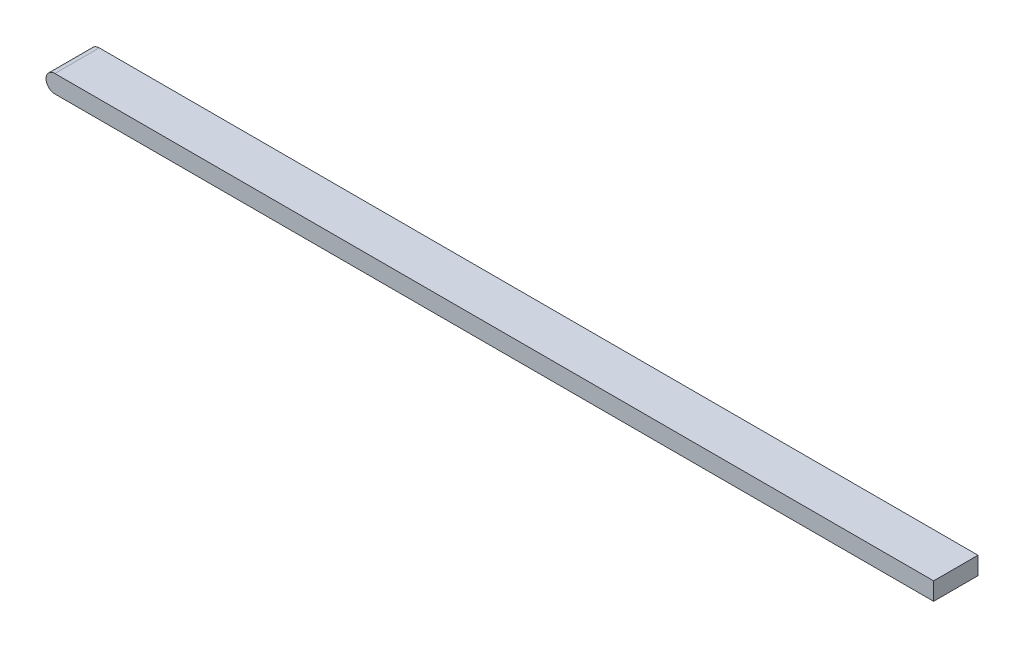
ISO-10303-21;
HEADER;
FILE_DESCRIPTION(('STEP AP214'),'2;1');
FILE_NAME('part.step','',(''),(''),'','','');
FILE_SCHEMA(('AUTOMOTIVE_DESIGN { 1 0 10303 214 1 1 1 1 }'));
ENDSEC;
DATA;
#1=APPLICATION_CONTEXT('core data for automotive mechanical design processes');
#2=APPLICATION_PROTOCOL_DEFINITION('international standard','automotive_design',2000,#1);
#3=PRODUCT_CONTEXT('',#1,'mechanical');
#4=PRODUCT('Part','Part','',(#3));
#5=PRODUCT_RELATED_PRODUCT_CATEGORY('part','',(#4));
#6=PRODUCT_DEFINITION_FORMATION('','',#4);
#7=PRODUCT_DEFINITION_CONTEXT('part definition',#1,'design');
#8=PRODUCT_DEFINITION('design','',#6,#7);
#9=PRODUCT_DEFINITION_SHAPE('','',#8);
#10=(LENGTH_UNIT() NAMED_UNIT(*) SI_UNIT(.MILLI.,.METRE.));
#11=(NAMED_UNIT(*) PLANE_ANGLE_UNIT() SI_UNIT($,.RADIAN.));
#12=(NAMED_UNIT(*) SI_UNIT($,.STERADIAN.) SOLID_ANGLE_UNIT());
#13=UNCERTAINTY_MEASURE_WITH_UNIT(LENGTH_MEASURE(1.E-05),#10,'distance_accuracy_value','');
#14=(GEOMETRIC_REPRESENTATION_CONTEXT(3) GLOBAL_UNCERTAINTY_ASSIGNED_CONTEXT((#13)) GLOBAL_UNIT_ASSIGNED_CONTEXT((#10,
#11,#12)) REPRESENTATION_CONTEXT('',''));
#15=CARTESIAN_POINT('',(0.,0.,0.));
#16=DIRECTION('',(0.,0.,1.));
#17=DIRECTION('',(1.,0.,0.));
#18=AXIS2_PLACEMENT_3D('',#15,#16,#17);
#19=CARTESIAN_POINT('',(0.,20.,0.));
#20=DIRECTION('',(0.,0.,-1.));
#21=DIRECTION('',(-1.,0.,0.));
#22=AXIS2_PLACEMENT_3D('',#19,#20,#21);
#23=PLANE('',#22);
#24=CARTESIAN_POINT('',(10.,10.,0.));
#25=DIRECTION('',(0.,0.,-1.));
#26=DIRECTION('',(-1.,0.,0.));
#27=AXIS2_PLACEMENT_3D('',#24,#25,#26);
#28=CIRCLE('',#27,10.);
#29=CARTESIAN_POINT('',(10.,20.,0.));
#30=VERTEX_POINT('',#29);
#31=CARTESIAN_POINT('',(0.,10.,0.));
#32=VERTEX_POINT('',#31);
#33=EDGE_CURVE('E96',#30,#32,#28,.F.);
#34=ORIENTED_EDGE('',*,*,#33,.T.);
#35=CARTESIAN_POINT('',(10.,10.,0.));
#36=DIRECTION('',(0.,0.,-1.));
#37=DIRECTION('',(-1.,0.,0.));
#38=AXIS2_PLACEMENT_3D('',#35,#36,#37);
#39=CIRCLE('',#38,10.);
#40=CARTESIAN_POINT('',(10.,0.,0.));
#41=VERTEX_POINT('',#40);
#42=EDGE_CURVE('E111',#32,#41,#39,.F.);
#43=ORIENTED_EDGE('',*,*,#42,.T.);
#44=DIRECTION('',(1.,0.,0.));
#45=VECTOR('',#44,1.);
#46=CARTESIAN_POINT('',(0.,0.,0.));
#47=LINE('',#46,#45);
#48=CARTESIAN_POINT('',(1000.,0.,0.));
#49=VERTEX_POINT('',#48);
#50=EDGE_CURVE('E93',#41,#49,#47,.T.);
#51=ORIENTED_EDGE('',*,*,#50,.T.);
#52=DIRECTION('',(0.,-1.,0.));
#53=VECTOR('',#52,1.);
#54=CARTESIAN_POINT('',(1000.,20.,0.));
#55=LINE('',#54,#53);
#56=CARTESIAN_POINT('',(1000.,20.,0.));
#57=VERTEX_POINT('',#56);
#58=EDGE_CURVE('E91',#57,#49,#55,.T.);
#59=ORIENTED_EDGE('',*,*,#58,.F.);
#60=DIRECTION('',(1.,0.,0.));
#61=VECTOR('',#60,1.);
#62=CARTESIAN_POINT('',(0.,20.,0.));
#63=LINE('',#62,#61);
#64=EDGE_CURVE('E79',#30,#57,#63,.T.);
#65=ORIENTED_EDGE('',*,*,#64,.F.);
#66=EDGE_LOOP('',(#34,#43,#51,#59,#65));
#67=FACE_BOUND('',#66,.T.);
#68=ADVANCED_FACE('F35',(#67),#23,.F.);
#69=CARTESIAN_POINT('',(1000.,20.,0.));
#70=DIRECTION('',(-1.,0.,0.));
#71=DIRECTION('',(0.,0.,1.));
#72=AXIS2_PLACEMENT_3D('',#69,#70,#71);
#73=PLANE('',#72);
#74=DIRECTION('',(0.,0.,-1.));
#75=VECTOR('',#74,1.);
#76=CARTESIAN_POINT('',(1000.,0.,0.));
#77=LINE('',#76,#75);
#78=CARTESIAN_POINT('',(1000.,0.,-50.));
#79=VERTEX_POINT('',#78);
#80=EDGE_CURVE('E106',#49,#79,#77,.T.);
#81=ORIENTED_EDGE('',*,*,#80,.T.);
#82=DIRECTION('',(0.,-1.,0.));
#83=VECTOR('',#82,1.);
#84=CARTESIAN_POINT('',(1000.,20.,-50.));
#85=LINE('',#84,#83);
#86=CARTESIAN_POINT('',(1000.,20.,-50.));
#87=VERTEX_POINT('',#86);
#88=EDGE_CURVE('E97',#87,#79,#85,.T.);
#89=ORIENTED_EDGE('',*,*,#88,.F.);
#90=DIRECTION('',(0.,0.,-1.));
#91=VECTOR('',#90,1.);
#92=CARTESIAN_POINT('',(1000.,20.,0.));
#93=LINE('',#92,#91);
#94=EDGE_CURVE('E83',#57,#87,#93,.T.);
#95=ORIENTED_EDGE('',*,*,#94,.F.);
#96=ORIENTED_EDGE('',*,*,#58,.T.);
#97=EDGE_LOOP('',(#81,#89,#95,#96));
#98=FACE_BOUND('',#97,.T.);
#99=ADVANCED_FACE('F99',(#98),#73,.F.);
#100=CARTESIAN_POINT('',(0.,20.,-50.));
#101=DIRECTION('',(0.,0.,1.));
#102=DIRECTION('',(1.,0.,0.));
#103=AXIS2_PLACEMENT_3D('',#100,#101,#102);
#104=PLANE('',#103);
#105=DIRECTION('',(-1.,0.,0.));
#106=VECTOR('',#105,1.);
#107=CARTESIAN_POINT('',(0.,0.,-50.));
#108=LINE('',#107,#106);
#109=CARTESIAN_POINT('',(10.,0.,-50.));
#110=VERTEX_POINT('',#109);
#111=EDGE_CURVE('E88',#79,#110,#108,.T.);
#112=ORIENTED_EDGE('',*,*,#111,.T.);
#113=CARTESIAN_POINT('',(10.,10.,-50.));
#114=DIRECTION('',(0.,0.,1.));
#115=DIRECTION('',(1.,0.,0.));
#116=AXIS2_PLACEMENT_3D('',#113,#114,#115);
#117=CIRCLE('',#116,10.);
#118=CARTESIAN_POINT('',(0.,10.,-50.));
#119=VERTEX_POINT('',#118);
#120=EDGE_CURVE('E44',#110,#119,#117,.F.);
#121=ORIENTED_EDGE('',*,*,#120,.T.);
#122=CARTESIAN_POINT('',(10.,10.,-50.));
#123=DIRECTION('',(0.,0.,1.));
#124=DIRECTION('',(1.,0.,0.));
#125=AXIS2_PLACEMENT_3D('',#122,#123,#124);
#126=CIRCLE('',#125,10.);
#127=CARTESIAN_POINT('',(10.,20.,-50.));
#128=VERTEX_POINT('',#127);
#129=EDGE_CURVE('E51',#119,#128,#126,.F.);
#130=ORIENTED_EDGE('',*,*,#129,.T.);
#131=DIRECTION('',(-1.,0.,0.));
#132=VECTOR('',#131,1.);
#133=CARTESIAN_POINT('',(0.,20.,-50.));
#134=LINE('',#133,#132);
#135=EDGE_CURVE('E101',#87,#128,#134,.T.);
#136=ORIENTED_EDGE('',*,*,#135,.F.);
#137=ORIENTED_EDGE('',*,*,#88,.T.);
#138=EDGE_LOOP('',(#112,#121,#130,#136,#137));
#139=FACE_BOUND('',#138,.T.);
#140=ADVANCED_FACE('F123',(#139),#104,.F.);
#141=CARTESIAN_POINT('',(0.,20.,0.));
#142=DIRECTION('',(0.,-1.,0.));
#143=DIRECTION('',(0.,0.,-1.));
#144=AXIS2_PLACEMENT_3D('',#141,#142,#143);
#145=PLANE('',#144);
#146=ORIENTED_EDGE('',*,*,#135,.T.);
#147=DIRECTION('',(0.,0.,1.));
#148=VECTOR('',#147,1.);
#149=CARTESIAN_POINT('',(10.,20.,0.));
#150=LINE('',#149,#148);
#151=EDGE_CURVE('E11',#128,#30,#150,.T.);
#152=ORIENTED_EDGE('',*,*,#151,.T.);
#153=ORIENTED_EDGE('',*,*,#64,.T.);
#154=ORIENTED_EDGE('',*,*,#94,.T.);
#155=EDGE_LOOP('',(#146,#152,#153,#154));
#156=FACE_BOUND('',#155,.T.);
#157=ADVANCED_FACE('F81',(#156),#145,.F.);
#158=CARTESIAN_POINT('',(0.,0.,0.));
#159=DIRECTION('',(0.,-1.,0.));
#160=DIRECTION('',(0.,0.,-1.));
#161=AXIS2_PLACEMENT_3D('',#158,#159,#160);
#162=PLANE('',#161);
#163=ORIENTED_EDGE('',*,*,#50,.F.);
#164=DIRECTION('',(0.,0.,1.));
#165=VECTOR('',#164,1.);
#166=CARTESIAN_POINT('',(10.,0.,-50.));
#167=LINE('',#166,#165);
#168=EDGE_CURVE('E113',#41,#110,#167,.F.);
#169=ORIENTED_EDGE('',*,*,#168,.T.);
#170=ORIENTED_EDGE('',*,*,#111,.F.);
#171=ORIENTED_EDGE('',*,*,#80,.F.);
#172=EDGE_LOOP('',(#163,#169,#170,#171));
#173=FACE_BOUND('',#172,.T.);
#174=ADVANCED_FACE('F120',(#173),#162,.T.);
#175=CARTESIAN_POINT('',(10.,10.,0.));
#176=DIRECTION('',(0.,0.,1.));
#177=DIRECTION('',(1.,0.,0.));
#178=AXIS2_PLACEMENT_3D('',#175,#176,#177);
#179=CYLINDRICAL_SURFACE('',#178,10.);
#180=ORIENTED_EDGE('',*,*,#151,.F.);
#181=ORIENTED_EDGE('',*,*,#129,.F.);
#182=DIRECTION('',(0.,0.,1.));
#183=VECTOR('',#182,1.);
#184=CARTESIAN_POINT('',(0.,10.,0.));
#185=LINE('',#184,#183);
#186=EDGE_CURVE('E39',#32,#119,#185,.F.);
#187=ORIENTED_EDGE('',*,*,#186,.F.);
#188=ORIENTED_EDGE('',*,*,#33,.F.);
#189=EDGE_LOOP('',(#180,#181,#187,#188));
#190=FACE_BOUND('',#189,.T.);
#191=ADVANCED_FACE('F37',(#190),#179,.T.);
#192=CARTESIAN_POINT('',(10.,10.,0.));
#193=DIRECTION('',(0.,0.,-1.));
#194=DIRECTION('',(-1.,0.,0.));
#195=AXIS2_PLACEMENT_3D('',#192,#193,#194);
#196=CYLINDRICAL_SURFACE('',#195,10.);
#197=ORIENTED_EDGE('',*,*,#120,.F.);
#198=ORIENTED_EDGE('',*,*,#168,.F.);
#199=ORIENTED_EDGE('',*,*,#42,.F.);
#200=ORIENTED_EDGE('',*,*,#186,.T.);
#201=EDGE_LOOP('',(#197,#198,#199,#200));
#202=FACE_BOUND('',#201,.T.);
#203=ADVANCED_FACE('F127',(#202),#196,.T.);
#204=CLOSED_SHELL('',(#68,#99,#140,#157,#174,#191,#203));
#205=MANIFOLD_SOLID_BREP('B2',#204);
#206=ADVANCED_BREP_SHAPE_REPRESENTATION('',(#18,#205),#14);
#207=SHAPE_DEFINITION_REPRESENTATION(#9,#206);
ENDSEC;
END-ISO-10303-21;
